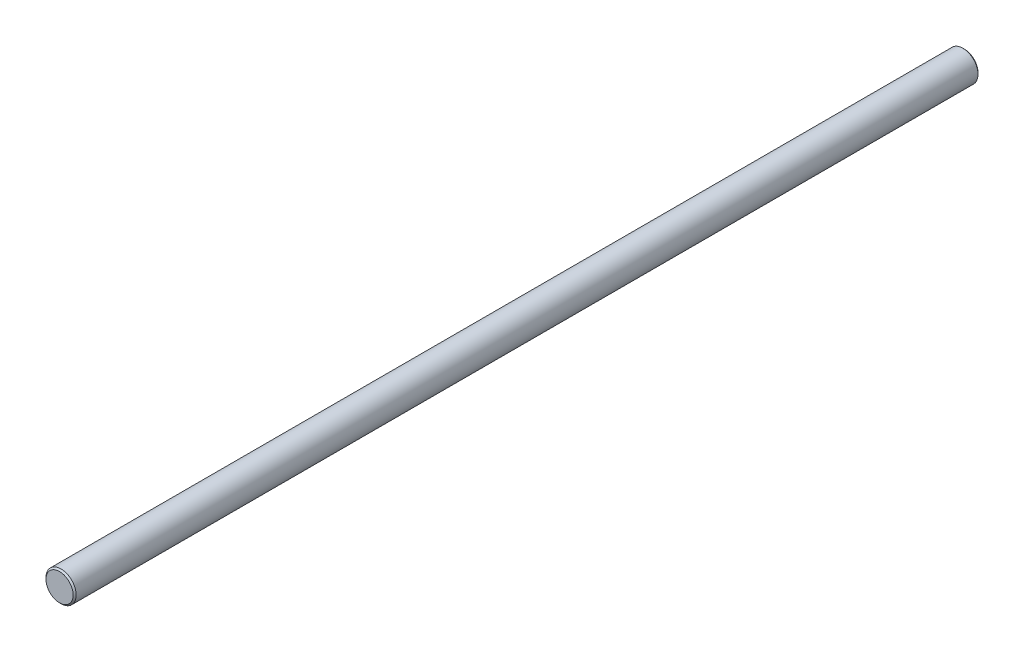
ISO-10303-21;
HEADER;
FILE_DESCRIPTION(('STEP AP214'),'2;1');
FILE_NAME('part.step','',(''),(''),'','','');
FILE_SCHEMA(('AUTOMOTIVE_DESIGN { 1 0 10303 214 1 1 1 1 }'));
ENDSEC;
DATA;
#1=APPLICATION_CONTEXT('core data for automotive mechanical design processes');
#2=APPLICATION_PROTOCOL_DEFINITION('international standard','automotive_design',2000,#1);
#3=PRODUCT_CONTEXT('',#1,'mechanical');
#4=PRODUCT('Part','Part','',(#3));
#5=PRODUCT_RELATED_PRODUCT_CATEGORY('part','',(#4));
#6=PRODUCT_DEFINITION_FORMATION('','',#4);
#7=PRODUCT_DEFINITION_CONTEXT('part definition',#1,'design');
#8=PRODUCT_DEFINITION('design','',#6,#7);
#9=PRODUCT_DEFINITION_SHAPE('','',#8);
#10=(LENGTH_UNIT() NAMED_UNIT(*) SI_UNIT(.MILLI.,.METRE.));
#11=(NAMED_UNIT(*) PLANE_ANGLE_UNIT() SI_UNIT($,.RADIAN.));
#12=(NAMED_UNIT(*) SI_UNIT($,.STERADIAN.) SOLID_ANGLE_UNIT());
#13=UNCERTAINTY_MEASURE_WITH_UNIT(LENGTH_MEASURE(1.E-05),#10,'distance_accuracy_value','');
#14=(GEOMETRIC_REPRESENTATION_CONTEXT(3) GLOBAL_UNCERTAINTY_ASSIGNED_CONTEXT((#13)) GLOBAL_UNIT_ASSIGNED_CONTEXT((#10,
#11,#12)) REPRESENTATION_CONTEXT('',''));
#15=CARTESIAN_POINT('',(0.,0.,0.));
#16=DIRECTION('',(0.,0.,1.));
#17=DIRECTION('',(1.,0.,0.));
#18=AXIS2_PLACEMENT_3D('',#15,#16,#17);
#19=CARTESIAN_POINT('',(0.,0.,300.));
#20=DIRECTION('',(0.,0.,-1.));
#21=DIRECTION('',(-1.,0.,0.));
#22=AXIS2_PLACEMENT_3D('',#19,#20,#21);
#23=CYLINDRICAL_SURFACE('',#22,5.);
#24=CARTESIAN_POINT('',(0.,0.,299.5));
#25=DIRECTION('',(0.,0.,1.));
#26=DIRECTION('',(1.,0.,0.));
#27=AXIS2_PLACEMENT_3D('',#24,#25,#26);
#28=CIRCLE('',#27,5.);
#29=CARTESIAN_POINT('',(5.,0.,299.5));
#30=VERTEX_POINT('',#29);
#31=EDGE_CURVE('E49',#30,#30,#28,.F.);
#32=ORIENTED_EDGE('',*,*,#31,.T.);
#33=EDGE_LOOP('',(#32));
#34=FACE_BOUND('',#33,.T.);
#35=CARTESIAN_POINT('',(0.,0.,0.500000000000056));
#36=DIRECTION('',(0.,0.,1.));
#37=DIRECTION('',(1.,0.,0.));
#38=AXIS2_PLACEMENT_3D('',#35,#36,#37);
#39=CIRCLE('',#38,5.);
#40=CARTESIAN_POINT('',(5.,0.,0.500000000000056));
#41=VERTEX_POINT('',#40);
#42=EDGE_CURVE('E53',#41,#41,#39,.T.);
#43=ORIENTED_EDGE('',*,*,#42,.T.);
#44=EDGE_LOOP('',(#43));
#45=FACE_BOUND('',#44,.T.);
#46=ADVANCED_FACE('F41',(#34,#45),#23,.T.);
#47=CARTESIAN_POINT('',(0.,0.,300.));
#48=DIRECTION('',(0.,0.,1.));
#49=DIRECTION('',(1.,0.,0.));
#50=AXIS2_PLACEMENT_3D('',#47,#48,#49);
#51=PLANE('',#50);
#52=CARTESIAN_POINT('',(0.,0.,300.));
#53=DIRECTION('',(0.,0.,1.));
#54=DIRECTION('',(1.,0.,0.));
#55=AXIS2_PLACEMENT_3D('',#52,#53,#54);
#56=CIRCLE('',#55,4.49999999999995);
#57=CARTESIAN_POINT('',(4.49999999999995,0.,300.));
#58=VERTEX_POINT('',#57);
#59=EDGE_CURVE('E57',#58,#58,#56,.T.);
#60=ORIENTED_EDGE('',*,*,#59,.T.);
#61=EDGE_LOOP('',(#60));
#62=FACE_BOUND('',#61,.T.);
#63=ADVANCED_FACE('F63',(#62),#51,.T.);
#64=CARTESIAN_POINT('',(0.,0.,0.));
#65=DIRECTION('',(0.,0.,1.));
#66=DIRECTION('',(1.,0.,0.));
#67=AXIS2_PLACEMENT_3D('',#64,#65,#66);
#68=PLANE('',#67);
#69=CARTESIAN_POINT('',(0.,0.,0.));
#70=DIRECTION('',(0.,0.,1.));
#71=DIRECTION('',(1.,0.,0.));
#72=AXIS2_PLACEMENT_3D('',#69,#70,#71);
#73=CIRCLE('',#72,4.49999999999998);
#74=CARTESIAN_POINT('',(4.49999999999998,0.,0.));
#75=VERTEX_POINT('',#74);
#76=EDGE_CURVE('E10',#75,#75,#73,.F.);
#77=ORIENTED_EDGE('',*,*,#76,.T.);
#78=EDGE_LOOP('',(#77));
#79=FACE_BOUND('',#78,.T.);
#80=ADVANCED_FACE('F67',(#79),#68,.F.);
#81=CARTESIAN_POINT('',(0.,0.,300.));
#82=DIRECTION('',(0.,0.,-1.));
#83=DIRECTION('',(-1.,0.,0.));
#84=AXIS2_PLACEMENT_3D('',#81,#82,#83);
#85=CONICAL_SURFACE('',#84,4.49999999999995,0.785398163397499);
#86=ORIENTED_EDGE('',*,*,#31,.F.);
#87=EDGE_LOOP('',(#86));
#88=FACE_BOUND('',#87,.T.);
#89=ORIENTED_EDGE('',*,*,#59,.F.);
#90=EDGE_LOOP('',(#89));
#91=FACE_BOUND('',#90,.T.);
#92=ADVANCED_FACE('F65',(#88,#91),#85,.T.);
#93=CARTESIAN_POINT('',(0.,0.,0.500000000000056));
#94=DIRECTION('',(0.,0.,1.));
#95=DIRECTION('',(1.,0.,0.));
#96=AXIS2_PLACEMENT_3D('',#93,#94,#95);
#97=CONICAL_SURFACE('',#96,5.,0.785398163397415);
#98=ORIENTED_EDGE('',*,*,#76,.F.);
#99=EDGE_LOOP('',(#98));
#100=FACE_BOUND('',#99,.T.);
#101=ORIENTED_EDGE('',*,*,#42,.F.);
#102=EDGE_LOOP('',(#101));
#103=FACE_BOUND('',#102,.T.);
#104=ADVANCED_FACE('F44',(#100,#103),#97,.T.);
#105=CLOSED_SHELL('',(#46,#63,#80,#92,#104));
#106=MANIFOLD_SOLID_BREP('B2',#105);
#107=ADVANCED_BREP_SHAPE_REPRESENTATION('',(#18,#106),#14);
#108=SHAPE_DEFINITION_REPRESENTATION(#9,#107);
ENDSEC;
END-ISO-10303-21;
